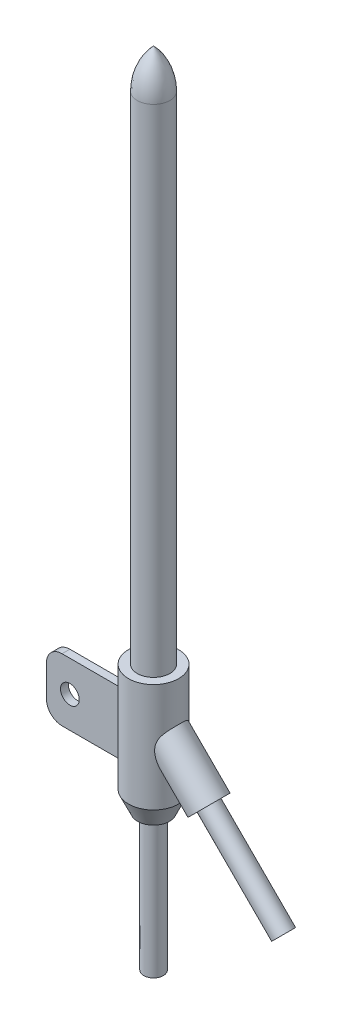
ISO-10303-21;
HEADER;
FILE_DESCRIPTION(('STEP AP214'),'2;1');
FILE_NAME('part.step','',(''),(''),'','','');
FILE_SCHEMA(('AUTOMOTIVE_DESIGN { 1 0 10303 214 1 1 1 1 }'));
ENDSEC;
DATA;
#1=APPLICATION_CONTEXT('core data for automotive mechanical design processes');
#2=APPLICATION_PROTOCOL_DEFINITION('international standard','automotive_design',2000,#1);
#3=PRODUCT_CONTEXT('',#1,'mechanical');
#4=PRODUCT('Part','Part','',(#3));
#5=PRODUCT_RELATED_PRODUCT_CATEGORY('part','',(#4));
#6=PRODUCT_DEFINITION_FORMATION('','',#4);
#7=PRODUCT_DEFINITION_CONTEXT('part definition',#1,'design');
#8=PRODUCT_DEFINITION('design','',#6,#7);
#9=PRODUCT_DEFINITION_SHAPE('','',#8);
#10=(LENGTH_UNIT() NAMED_UNIT(*) SI_UNIT(.MILLI.,.METRE.));
#11=(NAMED_UNIT(*) PLANE_ANGLE_UNIT() SI_UNIT($,.RADIAN.));
#12=(NAMED_UNIT(*) SI_UNIT($,.STERADIAN.) SOLID_ANGLE_UNIT());
#13=UNCERTAINTY_MEASURE_WITH_UNIT(LENGTH_MEASURE(1.E-05),#10,'distance_accuracy_value','');
#14=(GEOMETRIC_REPRESENTATION_CONTEXT(3) GLOBAL_UNCERTAINTY_ASSIGNED_CONTEXT((#13)) GLOBAL_UNIT_ASSIGNED_CONTEXT((#10,
#11,#12)) REPRESENTATION_CONTEXT('',''));
#15=CARTESIAN_POINT('',(0.,0.,0.));
#16=DIRECTION('',(0.,0.,1.));
#17=DIRECTION('',(1.,0.,0.));
#18=AXIS2_PLACEMENT_3D('',#15,#16,#17);
#19=CARTESIAN_POINT('',(0.,0.,0.));
#20=DIRECTION('',(0.,1.,0.));
#21=DIRECTION('',(0.,0.,1.));
#22=AXIS2_PLACEMENT_3D('',#19,#20,#21);
#23=CYLINDRICAL_SURFACE('',#22,3.21);
#24=CARTESIAN_POINT('',(0.,-4.2,0.));
#25=DIRECTION('',(0.,-1.,0.));
#26=DIRECTION('',(0.,0.,-1.));
#27=AXIS2_PLACEMENT_3D('',#24,#25,#26);
#28=CIRCLE('',#27,3.21);
#29=CARTESIAN_POINT('',(-3.17082008319614,-4.2,-0.5));
#30=VERTEX_POINT('',#29);
#31=CARTESIAN_POINT('',(-3.17082008319614,-4.2,0.5));
#32=VERTEX_POINT('',#31);
#33=EDGE_CURVE('E101',#30,#32,#28,.F.);
#34=ORIENTED_EDGE('',*,*,#33,.T.);
#35=DIRECTION('',(0.,1.,0.));
#36=VECTOR('',#35,1.);
#37=CARTESIAN_POINT('',(-3.17082008319614,0.,0.5));
#38=LINE('',#37,#36);
#39=CARTESIAN_POINT('',(-3.17082008319614,-12.2,0.5));
#40=VERTEX_POINT('',#39);
#41=EDGE_CURVE('E108',#32,#40,#38,.F.);
#42=ORIENTED_EDGE('',*,*,#41,.T.);
#43=CARTESIAN_POINT('',(0.,-12.2,0.));
#44=DIRECTION('',(0.,1.,0.));
#45=DIRECTION('',(0.,0.,1.));
#46=AXIS2_PLACEMENT_3D('',#43,#44,#45);
#47=CIRCLE('',#46,3.21);
#48=CARTESIAN_POINT('',(-3.17082008319614,-12.2,-0.500000000000001));
#49=VERTEX_POINT('',#48);
#50=EDGE_CURVE('E120',#40,#49,#47,.F.);
#51=ORIENTED_EDGE('',*,*,#50,.T.);
#52=DIRECTION('',(0.,1.,0.));
#53=VECTOR('',#52,1.);
#54=CARTESIAN_POINT('',(-3.17082008319614,0.,-0.5));
#55=LINE('',#54,#53);
#56=EDGE_CURVE('E115',#49,#30,#55,.T.);
#57=ORIENTED_EDGE('',*,*,#56,.T.);
#58=EDGE_LOOP('',(#34,#42,#51,#57));
#59=FACE_BOUND('',#58,.T.);
#60=CARTESIAN_POINT('',(0.,0.,0.));
#61=DIRECTION('',(0.,1.,0.));
#62=DIRECTION('',(0.,0.,1.));
#63=AXIS2_PLACEMENT_3D('',#60,#61,#62);
#64=CIRCLE('',#63,3.21);
#65=CARTESIAN_POINT('',(0.,0.,3.21));
#66=VERTEX_POINT('',#65);
#67=EDGE_CURVE('E150',#66,#66,#64,.T.);
#68=ORIENTED_EDGE('',*,*,#67,.F.);
#69=EDGE_LOOP('',(#68));
#70=FACE_BOUND('',#69,.T.);
#71=CARTESIAN_POINT('',(0.,-13.9,0.));
#72=DIRECTION('',(0.,1.,0.));
#73=DIRECTION('',(0.,0.,1.));
#74=AXIS2_PLACEMENT_3D('',#71,#72,#73);
#75=CIRCLE('',#74,3.21);
#76=CARTESIAN_POINT('',(0.,-13.9,3.21));
#77=VERTEX_POINT('',#76);
#78=EDGE_CURVE('E153',#77,#77,#75,.T.);
#79=ORIENTED_EDGE('',*,*,#78,.T.);
#80=EDGE_LOOP('',(#79));
#81=FACE_BOUND('',#80,.T.);
#82=CARTESIAN_POINT('',(3.21000000000001,-5.08873016277919,0.));
#83=CARTESIAN_POINT('',(3.20999311431765,-5.08873084020394,0.122870123853463));
#84=CARTESIAN_POINT('',(3.20289129528527,-5.09623393206909,0.245890223543839));
#85=CARTESIAN_POINT('',(3.1749496931834,-5.12638812685594,0.488646691791238));
#86=CARTESIAN_POINT('',(3.1540822234404,-5.14906975950939,0.608375934901423));
#87=CARTESIAN_POINT('',(3.10018620671481,-5.20991593801824,0.840943355881552));
#88=CARTESIAN_POINT('',(3.06716075189405,-5.24807654732925,0.95378327742489));
#89=CARTESIAN_POINT('',(2.99161933363153,-5.34048957741972,1.16932385838457));
#90=CARTESIAN_POINT('',(2.94910579151174,-5.39473789383986,1.27202709501542));
#91=CARTESIAN_POINT('',(2.88168894219305,-5.48802321719391,1.41517683404526));
#92=CARTESIAN_POINT('',(2.85879966806823,-5.52080547622095,1.46076414014724));
#93=CARTESIAN_POINT('',(2.81233193096208,-5.59042885279513,1.54833313252261));
#94=CARTESIAN_POINT('',(2.78875380814502,-5.62726799107416,1.59031655941932));
#95=CARTESIAN_POINT('',(2.74159261399743,-5.7049612576937,1.67030737586882));
#96=CARTESIAN_POINT('',(2.71800956596613,-5.74581176452394,1.70831828899278));
#97=CARTESIAN_POINT('',(2.67154272996064,-5.83141302767368,1.78010915761564));
#98=CARTESIAN_POINT('',(2.64865884818386,-5.87616325766164,1.81388968257954));
#99=CARTESIAN_POINT('',(2.5859897521827,-6.00790577253146,1.90308038422832));
#100=CARTESIAN_POINT('',(2.54784317116086,-6.09927918817493,1.95333188603162));
#101=CARTESIAN_POINT('',(2.48015282434276,-6.29171710083478,2.03861704467622));
#102=CARTESIAN_POINT('',(2.45060875235446,-6.39278125275521,2.07365124317404));
#103=CARTESIAN_POINT('',(2.41188619013263,-6.55831911203861,2.11834108221631));
#104=CARTESIAN_POINT('',(2.39931935250274,-6.62086417256317,2.13251684746763));
#105=CARTESIAN_POINT('',(2.37779787659621,-6.74740531966717,2.15648664757411));
#106=CARTESIAN_POINT('',(2.36884401385606,-6.81140171466969,2.16627974172424));
#107=CARTESIAN_POINT('',(2.34718118573283,-7.00485050935955,2.18982722576474));
#108=CARTESIAN_POINT('',(2.33970198983663,-7.13562537927791,2.19771558245089));
#109=CARTESIAN_POINT('',(2.33647680485254,-7.37588901625346,2.20112167481393));
#110=CARTESIAN_POINT('',(2.33901748881019,-7.48537394185722,2.1984457394267));
#111=CARTESIAN_POINT('',(2.35047846360956,-7.70368389541433,2.18618967509848));
#112=CARTESIAN_POINT('',(2.35940374081411,-7.81250834049707,2.17660414972759));
#113=CARTESIAN_POINT('',(2.38229977552922,-8.02933119125767,2.15151873825194));
#114=CARTESIAN_POINT('',(2.39628998247185,-8.13732475115393,2.13599604012583));
#115=CARTESIAN_POINT('',(2.42818005197748,-8.35184768587803,2.09967260901935));
#116=CARTESIAN_POINT('',(2.44608109861089,-8.45837660685709,2.07887027723475));
#117=CARTESIAN_POINT('',(2.49588695963398,-8.72975321370137,2.01913544419775));
#118=CARTESIAN_POINT('',(2.52997687148933,-8.8934192739933,1.9766109004265));
#119=CARTESIAN_POINT('',(2.60292102982417,-9.21622380215978,1.87952176844961));
#120=CARTESIAN_POINT('',(2.64178067731668,-9.37535688126347,1.82494347424527));
#121=CARTESIAN_POINT('',(2.72219933911561,-9.68773099630865,1.70267871639446));
#122=CARTESIAN_POINT('',(2.76375570100529,-9.84097759270842,1.63500500696643));
#123=CARTESIAN_POINT('',(2.82662963229799,-10.064617158084,1.52187557922512));
#124=CARTESIAN_POINT('',(2.84765994013671,-10.1380672715441,1.48226673758558));
#125=CARTESIAN_POINT('',(2.88964641162839,-10.2824899077414,1.39865600176153));
#126=CARTESIAN_POINT('',(2.91060256178837,-10.3534619985312,1.35465334679441));
#127=CARTESIAN_POINT('',(2.95029996725553,-10.4861972191377,1.2656979997688));
#128=CARTESIAN_POINT('',(2.96907574714885,-10.5482253163696,1.2211583285026));
#129=CARTESIAN_POINT('',(3.00593797372499,-10.6688011303841,1.12737547771214));
#130=CARTESIAN_POINT('',(3.0240248924609,-10.727351246488,1.07813560326823));
#131=CARTESIAN_POINT('',(3.05894602443517,-10.8394610931837,0.974634465621498));
#132=CARTESIAN_POINT('',(3.0757884171283,-10.893054127416,0.920412474168766));
#133=CARTESIAN_POINT('',(3.10772138705329,-10.9939849200873,0.806030842583719));
#134=CARTESIAN_POINT('',(3.12281513079639,-11.041334007479,0.745882311997692));
#135=CARTESIAN_POINT('',(3.14799823123335,-11.1199289530871,0.630137123920566));
#136=CARTESIAN_POINT('',(3.15850133325356,-11.1525431715321,0.575572102270518));
#137=CARTESIAN_POINT('',(3.17709036300056,-11.2100845163059,0.462058785561174));
#138=CARTESIAN_POINT('',(3.18517644566854,-11.2350121353814,0.403110771772888));
#139=CARTESIAN_POINT('',(3.19827794054241,-11.2753260019749,0.28092889738826));
#140=CARTESIAN_POINT('',(3.20326043130665,-11.2906099755652,0.217656734191248));
#141=CARTESIAN_POINT('',(3.20940093848116,-11.3094382581878,0.0892214229249783));
#142=CARTESIAN_POINT('',(3.21056365391797,-11.312996991439,0.024060697812859));
#143=CARTESIAN_POINT('',(3.20899895294742,-11.3082027390738,-0.0992603307918366));
#144=CARTESIAN_POINT('',(3.20664575947551,-11.3009956522405,-0.15747423531002));
#145=CARTESIAN_POINT('',(3.19898450701758,-11.2774851873005,-0.271828574719362));
#146=CARTESIAN_POINT('',(3.1936740606494,-11.2611744598255,-0.32796729522243));
#147=CARTESIAN_POINT('',(3.17841770456261,-11.2141776481016,-0.455089106135116));
#148=CARTESIAN_POINT('',(3.16751990482844,-11.1805223544136,-0.524847583579714));
#149=CARTESIAN_POINT('',(3.14259261526189,-11.1031066647564,-0.657895041444185));
#150=CARTESIAN_POINT('',(3.12855579037012,-11.0593225921534,-0.721168354360491));
#151=CARTESIAN_POINT('',(3.10091062527564,-10.9724904045089,-0.831331932707917));
#152=CARTESIAN_POINT('',(3.08762344283904,-10.9305445265991,-0.879192148952453));
#153=CARTESIAN_POINT('',(3.06001119983444,-10.8427985215549,-0.970939818749609));
#154=CARTESIAN_POINT('',(3.04568540466112,-10.7969956626262,-1.01482441002563));
#155=CARTESIAN_POINT('',(3.00162008533716,-10.6550344339842,-1.14122120891331));
#156=CARTESIAN_POINT('',(2.97082422773048,-10.5544218881508,-1.21835918752489));
#157=CARTESIAN_POINT('',(2.9082992817983,-10.3460691374395,-1.36084745971319));
#158=CARTESIAN_POINT('',(2.87657260524961,-10.2383465807271,-1.42622554278903));
#159=CARTESIAN_POINT('',(2.81316082750106,-10.0175980420999,-1.54754873430624));
#160=CARTESIAN_POINT('',(2.7814758003391,-9.90456682891464,-1.60348427752569));
#161=CARTESIAN_POINT('',(2.71892100304671,-9.67411377905549,-1.70741212916448));
#162=CARTESIAN_POINT('',(2.68805529115286,-9.55667525726479,-1.75536950491916));
#163=CARTESIAN_POINT('',(2.62811552640189,-9.31867763426748,-1.84389817684783));
#164=CARTESIAN_POINT('',(2.59904069475169,-9.19811992234577,-1.88447269879046));
#165=CARTESIAN_POINT('',(2.54002797297156,-8.93879178129103,-1.96343678483336));
#166=CARTESIAN_POINT('',(2.51045010087669,-8.79965410406099,-2.00089313351377));
#167=CARTESIAN_POINT('',(2.45621527859292,-8.51824091585318,-2.06710821909327));
#168=CARTESIAN_POINT('',(2.43156217700148,-8.37596304655453,-2.09586016267011));
#169=CARTESIAN_POINT('',(2.38941437202781,-8.08959455978903,-2.14378429774904));
#170=CARTESIAN_POINT('',(2.37187791626659,-7.94551978186435,-2.16301251487465));
#171=CARTESIAN_POINT('',(2.3465737847621,-7.65557968977595,-2.19044742792173));
#172=CARTESIAN_POINT('',(2.33878916748208,-7.50971792662671,-2.1986732396363));
#173=CARTESIAN_POINT('',(2.33675611224054,-7.24202573111427,-2.20083527026306));
#174=CARTESIAN_POINT('',(2.34046394565105,-7.12025066419454,-2.19692874955839));
#175=CARTESIAN_POINT('',(2.35934940449924,-6.8786139663304,-2.17664580893349));
#176=CARTESIAN_POINT('',(2.37451424621004,-6.75875035468643,-2.16028328726104));
#177=CARTESIAN_POINT('',(2.41794978078693,-6.52286785997722,-2.11156513742234));
#178=CARTESIAN_POINT('',(2.44638062005174,-6.4069150633484,-2.07901375277063));
#179=CARTESIAN_POINT('',(2.49777822107881,-6.24104465354132,-2.016408398628));
#180=CARTESIAN_POINT('',(2.51637497418198,-6.18708534400865,-1.99323615769491));
#181=CARTESIAN_POINT('',(2.55596807735027,-6.08235848946096,-1.94220993792781));
#182=CARTESIAN_POINT('',(2.57696420784941,-6.03159065305365,-1.91435638736873));
#183=CARTESIAN_POINT('',(2.63736049017951,-5.89656420783095,-1.83104057515026));
#184=CARTESIAN_POINT('',(2.6786417983489,-5.8161066770793,-1.77066051522982));
#185=CARTESIAN_POINT('',(2.7625584627489,-5.6680235251077,-1.63664629711214));
#186=CARTESIAN_POINT('',(2.80519455990868,-5.60040507159894,-1.56300477983426));
#187=CARTESIAN_POINT('',(2.88769278735599,-5.47844997888725,-1.40472731952727));
#188=CARTESIAN_POINT('',(2.92756600600785,-5.42405774899574,-1.32013976624783));
#189=CARTESIAN_POINT('',(3.00162051009025,-5.32783243251658,-1.14179997129103));
#190=CARTESIAN_POINT('',(3.03579879376697,-5.28600595996926,-1.04804293751142));
#191=CARTESIAN_POINT('',(3.09906978280692,-5.21099371676397,-0.844015940664478));
#192=CARTESIAN_POINT('',(3.12733396503225,-5.17905913420678,-0.733028453924925));
#193=CARTESIAN_POINT('',(3.17201629569762,-5.12945974307399,-0.505755778399475));
#194=CARTESIAN_POINT('',(3.18845341971215,-5.11177207099209,-0.389479395407311));
#195=CARTESIAN_POINT('',(3.20228558684713,-5.09695262783307,-0.227009877899133));
#196=CARTESIAN_POINT('',(3.20517422343544,-5.09386925990056,-0.181716127292507));
#197=CARTESIAN_POINT('',(3.2090326956506,-5.08975791155265,-0.0909551017359539));
#198=CARTESIAN_POINT('',(3.21000254915295,-5.08872991198933,-0.0454878284065279));
#199=CARTESIAN_POINT('',(3.21000000000001,-5.08873016277919,0.));
#200=B_SPLINE_CURVE_WITH_KNOTS('',3,(#82,#83,#84,#85,#86,#87,#88,#89,#90,#91,#92,#93,#94,#95,
#96,#97,#98,#99,#100,#101,#102,#103,#104,#105,#106,#107,#108,#109,#110,#111,#112,#113,#114,#115,
#116,#117,#118,#119,#120,#121,#122,#123,#124,#125,#126,#127,#128,#129,#130,#131,#132,#133,#134,
#135,#136,#137,#138,#139,#140,#141,#142,#143,#144,#145,#146,#147,#148,#149,#150,#151,#152,#153,
#154,#155,#156,#157,#158,#159,#160,#161,#162,#163,#164,#165,#166,#167,#168,#169,#170,#171,#172,
#173,#174,#175,#176,#177,#178,#179,#180,#181,#182,#183,#184,#185,#186,#187,#188,#189,#190,#191,
#192,#193,#194,#195,#196,#197,#198,#199),.UNSPECIFIED.,.T.,.F.,(4,2,2,2,2,2,2,2,2,2,2,2,2,2,2,2,
2,2,2,2,2,2,2,2,2,2,2,2,2,2,2,2,2,2,2,2,2,2,2,2,2,2,2,2,2,2,2,2,2,2,2,2,2,2,2,2,2,2,4),(0.,
0.368441654801494,0.737626620153166,1.10671775483575,1.4757148064212,1.6574227582893,
1.83904244807273,2.02049965120281,2.20193240152807,2.53310708811124,2.86426998563921,
3.06007335869533,3.25591873923441,3.64803801808704,3.97626172330713,4.30474205127501,
4.63449736697885,4.96435266017919,5.4812384859276,5.99871510282935,6.51569023964355,
6.77375246253244,7.03185944627085,7.26759188002828,7.50315975614085,7.737008330689,
7.97042659723548,8.16319298703953,8.35594701704989,8.55071234659274,8.74523798904392,
8.9204792474333,9.09586218313173,9.32919839086895,9.5630856483315,9.75784562301094,
9.95274472017444,10.3430069660992,10.7323345182625,11.1220541200095,11.5134376016127,
11.9046496643855,12.3455863395015,12.7868662601806,13.2255184639314,13.6634075505331,
14.0281574726656,14.3925010069104,14.7613614161338,14.945882590261,15.1303868924384,
15.4548205928527,15.7794348867314,16.1026602611161,16.4260554696852,16.7811952020531,
17.1357638626661,17.2721661578819,17.4085671823605),.UNSPECIFIED.);
#201=CARTESIAN_POINT('',(3.21000000000001,-5.08873016277919,0.));
#202=VERTEX_POINT('',#201);
#203=EDGE_CURVE('E147',#202,#202,#200,.T.);
#204=ORIENTED_EDGE('',*,*,#203,.F.);
#205=EDGE_LOOP('',(#204));
#206=FACE_BOUND('',#205,.T.);
#207=ADVANCED_FACE('F38',(#59,#70,#81,#206),#23,.T.);
#208=CARTESIAN_POINT('',(0.,63.5,0.));
#209=DIRECTION('',(0.,-1.,0.));
#210=DIRECTION('',(0.,0.,-1.));
#211=AXIS2_PLACEMENT_3D('',#208,#209,#210);
#212=CYLINDRICAL_SURFACE('',#211,2.085);
#213=CARTESIAN_POINT('',(0.,63.5,0.));
#214=DIRECTION('',(0.,1.,0.));
#215=DIRECTION('',(0.,0.,1.));
#216=AXIS2_PLACEMENT_3D('',#213,#214,#215);
#217=CIRCLE('',#216,2.085);
#218=CARTESIAN_POINT('',(0.,63.5,2.085));
#219=VERTEX_POINT('',#218);
#220=EDGE_CURVE('E160',#219,#219,#217,.T.);
#221=ORIENTED_EDGE('',*,*,#220,.F.);
#222=EDGE_LOOP('',(#221));
#223=FACE_BOUND('',#222,.T.);
#224=CARTESIAN_POINT('',(0.,0.,0.));
#225=DIRECTION('',(0.,1.,0.));
#226=DIRECTION('',(0.,0.,1.));
#227=AXIS2_PLACEMENT_3D('',#224,#225,#226);
#228=CIRCLE('',#227,2.085);
#229=CARTESIAN_POINT('',(0.,0.,2.085));
#230=VERTEX_POINT('',#229);
#231=EDGE_CURVE('E159',#230,#230,#228,.T.);
#232=ORIENTED_EDGE('',*,*,#231,.T.);
#233=EDGE_LOOP('',(#232));
#234=FACE_BOUND('',#233,.T.);
#235=ADVANCED_FACE('F228',(#223,#234),#212,.T.);
#236=CARTESIAN_POINT('',(0.,63.5,4.95270383693047));
#237=DIRECTION('',(-1.,0.,0.));
#238=DIRECTION('',(0.,0.,-1.));
#239=AXIS2_PLACEMENT_3D('',#236,#237,#238);
#240=CIRCLE('',#239,7.03770383693047);
#241=TRIMMED_CURVE('',#240,(PARAMETER_VALUE(-0.790150219504949)),
(PARAMETER_VALUE(0.790150219504949)),.T.,.PARAMETER.);
#242=CARTESIAN_POINT('',(0.,63.5,0.));
#243=DIRECTION('',(0.,-1.,0.));
#244=AXIS1_PLACEMENT('',#242,#243);
#245=SURFACE_OF_REVOLUTION('',#241,#244);
#246=CARTESIAN_POINT('',(0.,68.5,0.));
#247=VERTEX_POINT('',#246);
#248=VERTEX_LOOP('',#247);
#249=FACE_BOUND('',#248,.T.);
#250=ORIENTED_EDGE('',*,*,#220,.T.);
#251=EDGE_LOOP('',(#250));
#252=FACE_BOUND('',#251,.T.);
#253=ADVANCED_FACE('F232',(#249,#252),#245,.T.);
#254=CARTESIAN_POINT('',(3.21,0.,0.));
#255=DIRECTION('',(0.,-1.,0.));
#256=DIRECTION('',(0.,0.,-1.));
#257=AXIS2_PLACEMENT_3D('',#254,#255,#256);
#258=PLANE('',#257);
#259=ORIENTED_EDGE('',*,*,#231,.F.);
#260=EDGE_LOOP('',(#259));
#261=FACE_BOUND('',#260,.T.);
#262=ORIENTED_EDGE('',*,*,#67,.T.);
#263=EDGE_LOOP('',(#262));
#264=FACE_BOUND('',#263,.T.);
#265=ADVANCED_FACE('F238',(#261,#264),#258,.F.);
#266=CARTESIAN_POINT('',(0.,-16.4,0.));
#267=DIRECTION('',(0.,1.,0.));
#268=DIRECTION('',(0.,0.,1.));
#269=AXIS2_PLACEMENT_3D('',#266,#267,#268);
#270=PLANE('',#269);
#271=CARTESIAN_POINT('',(0.,-16.4,0.));
#272=DIRECTION('',(0.,-1.,0.));
#273=DIRECTION('',(0.,0.,-1.));
#274=AXIS2_PLACEMENT_3D('',#271,#272,#273);
#275=CIRCLE('',#274,1.25);
#276=CARTESIAN_POINT('',(0.,-16.4,-1.25));
#277=VERTEX_POINT('',#276);
#278=EDGE_CURVE('E137',#277,#277,#275,.T.);
#279=ORIENTED_EDGE('',*,*,#278,.F.);
#280=EDGE_LOOP('',(#279));
#281=FACE_BOUND('',#280,.T.);
#282=CARTESIAN_POINT('',(0.,-16.4,0.));
#283=DIRECTION('',(0.,1.,0.));
#284=DIRECTION('',(0.,0.,1.));
#285=AXIS2_PLACEMENT_3D('',#282,#283,#284);
#286=CIRCLE('',#285,2.05);
#287=CARTESIAN_POINT('',(0.,-16.4,2.05));
#288=VERTEX_POINT('',#287);
#289=EDGE_CURVE('E156',#288,#288,#286,.T.);
#290=ORIENTED_EDGE('',*,*,#289,.F.);
#291=EDGE_LOOP('',(#290));
#292=FACE_BOUND('',#291,.T.);
#293=ADVANCED_FACE('F246',(#281,#292),#270,.F.);
#294=CARTESIAN_POINT('',(0.,-16.4,0.));
#295=DIRECTION('',(0.,1.,0.));
#296=DIRECTION('',(0.,0.,1.));
#297=AXIS2_PLACEMENT_3D('',#294,#295,#296);
#298=CONICAL_SURFACE('',#297,2.05,0.434435142280984);
#299=ORIENTED_EDGE('',*,*,#78,.F.);
#300=EDGE_LOOP('',(#299));
#301=FACE_BOUND('',#300,.T.);
#302=ORIENTED_EDGE('',*,*,#289,.T.);
#303=EDGE_LOOP('',(#302));
#304=FACE_BOUND('',#303,.T.);
#305=ADVANCED_FACE('F180',(#301,#304),#298,.T.);
#306=CARTESIAN_POINT('',(-36.7464704021733,31.7564704021731,0.));
#307=DIRECTION('',(0.707106781186549,-0.707106781186546,0.));
#308=DIRECTION('',(0.707106781186546,0.707106781186549,0.));
#309=AXIS2_PLACEMENT_3D('',#306,#307,#308);
#310=CYLINDRICAL_SURFACE('',#309,2.2);
#311=CARTESIAN_POINT('',(7.09908729652602,-12.089087296526,0.));
#312=DIRECTION('',(-0.707106781186549,0.707106781186546,0.));
#313=DIRECTION('',(-0.707106781186546,-0.707106781186549,0.));
#314=AXIS2_PLACEMENT_3D('',#311,#312,#313);
#315=CIRCLE('',#314,2.2);
#316=CARTESIAN_POINT('',(5.54345237791562,-13.6447222151364,0.));
#317=VERTEX_POINT('',#316);
#318=EDGE_CURVE('E144',#317,#317,#315,.T.);
#319=ORIENTED_EDGE('',*,*,#318,.T.);
#320=EDGE_LOOP('',(#319));
#321=FACE_BOUND('',#320,.T.);
#322=ORIENTED_EDGE('',*,*,#203,.T.);
#323=EDGE_LOOP('',(#322));
#324=FACE_BOUND('',#323,.T.);
#325=ADVANCED_FACE('F175',(#321,#324),#310,.T.);
#326=CARTESIAN_POINT('',(7.09908729652602,-12.089087296526,0.));
#327=DIRECTION('',(-0.707106781186549,0.707106781186546,0.));
#328=DIRECTION('',(-0.707106781186546,-0.707106781186549,0.));
#329=AXIS2_PLACEMENT_3D('',#326,#327,#328);
#330=PLANE('',#329);
#331=CARTESIAN_POINT('',(7.09908729652602,-12.089087296526,0.));
#332=DIRECTION('',(0.707106781186549,-0.707106781186546,0.));
#333=DIRECTION('',(0.707106781186546,0.707106781186549,0.));
#334=AXIS2_PLACEMENT_3D('',#331,#332,#333);
#335=CIRCLE('',#334,1.25);
#336=CARTESIAN_POINT('',(7.98297077300921,-11.2052038200428,0.));
#337=VERTEX_POINT('',#336);
#338=EDGE_CURVE('E141',#337,#337,#335,.T.);
#339=ORIENTED_EDGE('',*,*,#338,.F.);
#340=EDGE_LOOP('',(#339));
#341=FACE_BOUND('',#340,.T.);
#342=ORIENTED_EDGE('',*,*,#318,.F.);
#343=EDGE_LOOP('',(#342));
#344=FACE_BOUND('',#343,.T.);
#345=ADVANCED_FACE('F179',(#341,#344),#330,.F.);
#346=CARTESIAN_POINT('',(16.6450288425444,-21.6350288425444,0.));
#347=DIRECTION('',(-0.707106781186549,0.707106781186546,0.));
#348=DIRECTION('',(-0.707106781186546,-0.707106781186549,0.));
#349=AXIS2_PLACEMENT_3D('',#346,#347,#348);
#350=CYLINDRICAL_SURFACE('',#349,1.25);
#351=CARTESIAN_POINT('',(16.6450288425444,-21.6350288425444,0.));
#352=DIRECTION('',(0.707106781186549,-0.707106781186546,0.));
#353=DIRECTION('',(0.707106781186546,0.707106781186549,0.));
#354=AXIS2_PLACEMENT_3D('',#351,#352,#353);
#355=CIRCLE('',#354,1.25);
#356=CARTESIAN_POINT('',(17.5289123190276,-20.7511453660612,0.));
#357=VERTEX_POINT('',#356);
#358=EDGE_CURVE('E136',#357,#357,#355,.T.);
#359=ORIENTED_EDGE('',*,*,#358,.F.);
#360=EDGE_LOOP('',(#359));
#361=FACE_BOUND('',#360,.T.);
#362=ORIENTED_EDGE('',*,*,#338,.T.);
#363=EDGE_LOOP('',(#362));
#364=FACE_BOUND('',#363,.T.);
#365=ADVANCED_FACE('F184',(#361,#364),#350,.T.);
#366=CARTESIAN_POINT('',(16.6450288425444,-21.6350288425444,0.));
#367=DIRECTION('',(0.707106781186549,-0.707106781186546,0.));
#368=DIRECTION('',(0.707106781186546,0.707106781186549,0.));
#369=AXIS2_PLACEMENT_3D('',#366,#367,#368);
#370=PLANE('',#369);
#371=ORIENTED_EDGE('',*,*,#358,.T.);
#372=EDGE_LOOP('',(#371));
#373=FACE_BOUND('',#372,.T.);
#374=ADVANCED_FACE('F188',(#373),#370,.T.);
#375=CARTESIAN_POINT('',(0.,-33.9,0.));
#376=DIRECTION('',(0.,1.,0.));
#377=DIRECTION('',(0.,0.,1.));
#378=AXIS2_PLACEMENT_3D('',#375,#376,#377);
#379=CYLINDRICAL_SURFACE('',#378,1.25);
#380=CARTESIAN_POINT('',(0.,-33.9,0.));
#381=DIRECTION('',(0.,-1.,0.));
#382=DIRECTION('',(0.,0.,-1.));
#383=AXIS2_PLACEMENT_3D('',#380,#381,#382);
#384=CIRCLE('',#383,1.25);
#385=CARTESIAN_POINT('',(0.,-33.9,-1.25));
#386=VERTEX_POINT('',#385);
#387=EDGE_CURVE('E104',#386,#386,#384,.T.);
#388=ORIENTED_EDGE('',*,*,#387,.F.);
#389=EDGE_LOOP('',(#388));
#390=FACE_BOUND('',#389,.T.);
#391=ORIENTED_EDGE('',*,*,#278,.T.);
#392=EDGE_LOOP('',(#391));
#393=FACE_BOUND('',#392,.T.);
#394=ADVANCED_FACE('F192',(#390,#393),#379,.T.);
#395=CARTESIAN_POINT('',(0.,-33.9,0.));
#396=DIRECTION('',(0.,-1.,0.));
#397=DIRECTION('',(0.,0.,-1.));
#398=AXIS2_PLACEMENT_3D('',#395,#396,#397);
#399=PLANE('',#398);
#400=ORIENTED_EDGE('',*,*,#387,.T.);
#401=EDGE_LOOP('',(#400));
#402=FACE_BOUND('',#401,.T.);
#403=ADVANCED_FACE('F196',(#402),#399,.T.);
#404=CARTESIAN_POINT('',(-13.21,-12.2,0.5));
#405=DIRECTION('',(0.,0.,1.));
#406=DIRECTION('',(1.,0.,0.));
#407=AXIS2_PLACEMENT_3D('',#404,#405,#406);
#408=PLANE('',#407);
#409=CARTESIAN_POINT('',(-10.21,-8.2,0.5));
#410=DIRECTION('',(0.,0.,1.));
#411=DIRECTION('',(1.,0.,0.));
#412=AXIS2_PLACEMENT_3D('',#409,#410,#411);
#413=CIRCLE('',#412,1.2);
#414=CARTESIAN_POINT('',(-9.01,-8.2,0.5));
#415=VERTEX_POINT('',#414);
#416=EDGE_CURVE('E437',#415,#415,#413,.T.);
#417=ORIENTED_EDGE('',*,*,#416,.F.);
#418=EDGE_LOOP('',(#417));
#419=FACE_BOUND('',#418,.T.);
#420=DIRECTION('',(0.,-1.,0.));
#421=VECTOR('',#420,1.);
#422=CARTESIAN_POINT('',(-13.21,-12.2,0.5));
#423=LINE('',#422,#421);
#424=CARTESIAN_POINT('',(-13.21,-6.2,0.5));
#425=VERTEX_POINT('',#424);
#426=CARTESIAN_POINT('',(-13.21,-10.2,0.5));
#427=VERTEX_POINT('',#426);
#428=EDGE_CURVE('E122',#425,#427,#423,.T.);
#429=ORIENTED_EDGE('',*,*,#428,.T.);
#430=CARTESIAN_POINT('',(-11.21,-10.2,0.5));
#431=DIRECTION('',(0.,0.,1.));
#432=DIRECTION('',(1.,0.,0.));
#433=AXIS2_PLACEMENT_3D('',#430,#431,#432);
#434=CIRCLE('',#433,2.);
#435=CARTESIAN_POINT('',(-11.21,-12.2,0.5));
#436=VERTEX_POINT('',#435);
#437=EDGE_CURVE('E46',#427,#436,#434,.T.);
#438=ORIENTED_EDGE('',*,*,#437,.T.);
#439=DIRECTION('',(1.,0.,0.));
#440=VECTOR('',#439,1.);
#441=CARTESIAN_POINT('',(-13.21,-12.2,0.5));
#442=LINE('',#441,#440);
#443=EDGE_CURVE('E111',#436,#40,#442,.T.);
#444=ORIENTED_EDGE('',*,*,#443,.T.);
#445=ORIENTED_EDGE('',*,*,#41,.F.);
#446=DIRECTION('',(1.,0.,0.));
#447=VECTOR('',#446,1.);
#448=CARTESIAN_POINT('',(-13.21,-4.2,0.5));
#449=LINE('',#448,#447);
#450=CARTESIAN_POINT('',(-11.21,-4.2,0.5));
#451=VERTEX_POINT('',#450);
#452=EDGE_CURVE('E96',#451,#32,#449,.T.);
#453=ORIENTED_EDGE('',*,*,#452,.F.);
#454=CARTESIAN_POINT('',(-11.21,-6.2,0.5));
#455=DIRECTION('',(0.,0.,1.));
#456=DIRECTION('',(1.,0.,0.));
#457=AXIS2_PLACEMENT_3D('',#454,#455,#456);
#458=CIRCLE('',#457,2.);
#459=EDGE_CURVE('E53',#451,#425,#458,.T.);
#460=ORIENTED_EDGE('',*,*,#459,.T.);
#461=EDGE_LOOP('',(#429,#438,#444,#445,#453,#460));
#462=FACE_BOUND('',#461,.T.);
#463=ADVANCED_FACE('F109',(#419,#462),#408,.T.);
#464=CARTESIAN_POINT('',(-13.21,-4.2,-0.5));
#465=DIRECTION('',(0.,1.,0.));
#466=DIRECTION('',(0.,0.,1.));
#467=AXIS2_PLACEMENT_3D('',#464,#465,#466);
#468=PLANE('',#467);
#469=DIRECTION('',(1.,0.,0.));
#470=VECTOR('',#469,1.);
#471=CARTESIAN_POINT('',(-13.21,-4.2,-0.5));
#472=LINE('',#471,#470);
#473=CARTESIAN_POINT('',(-11.21,-4.2,-0.5));
#474=VERTEX_POINT('',#473);
#475=EDGE_CURVE('E105',#474,#30,#472,.T.);
#476=ORIENTED_EDGE('',*,*,#475,.F.);
#477=DIRECTION('',(0.,0.,1.));
#478=VECTOR('',#477,1.);
#479=CARTESIAN_POINT('',(-11.21,-4.2,0.5));
#480=LINE('',#479,#478);
#481=EDGE_CURVE('E11',#474,#451,#480,.T.);
#482=ORIENTED_EDGE('',*,*,#481,.T.);
#483=ORIENTED_EDGE('',*,*,#452,.T.);
#484=ORIENTED_EDGE('',*,*,#33,.F.);
#485=EDGE_LOOP('',(#476,#482,#483,#484));
#486=FACE_BOUND('',#485,.T.);
#487=ADVANCED_FACE('F99',(#486),#468,.T.);
#488=CARTESIAN_POINT('',(-13.21,-12.2,-0.5));
#489=DIRECTION('',(0.,0.,-1.));
#490=DIRECTION('',(-1.,0.,0.));
#491=AXIS2_PLACEMENT_3D('',#488,#489,#490);
#492=PLANE('',#491);
#493=CARTESIAN_POINT('',(-10.21,-8.2,-0.5));
#494=DIRECTION('',(0.,0.,-1.));
#495=DIRECTION('',(-1.,0.,0.));
#496=AXIS2_PLACEMENT_3D('',#493,#494,#495);
#497=CIRCLE('',#496,1.2);
#498=CARTESIAN_POINT('',(-11.41,-8.2,-0.5));
#499=VERTEX_POINT('',#498);
#500=EDGE_CURVE('E116',#499,#499,#497,.T.);
#501=ORIENTED_EDGE('',*,*,#500,.F.);
#502=EDGE_LOOP('',(#501));
#503=FACE_BOUND('',#502,.T.);
#504=DIRECTION('',(1.,0.,0.));
#505=VECTOR('',#504,1.);
#506=CARTESIAN_POINT('',(-13.21,-12.2,-0.5));
#507=LINE('',#506,#505);
#508=CARTESIAN_POINT('',(-11.21,-12.2,-0.5));
#509=VERTEX_POINT('',#508);
#510=EDGE_CURVE('E131',#509,#49,#507,.T.);
#511=ORIENTED_EDGE('',*,*,#510,.F.);
#512=CARTESIAN_POINT('',(-11.21,-10.2,-0.5));
#513=DIRECTION('',(0.,0.,-1.));
#514=DIRECTION('',(-1.,0.,0.));
#515=AXIS2_PLACEMENT_3D('',#512,#513,#514);
#516=CIRCLE('',#515,2.);
#517=CARTESIAN_POINT('',(-13.21,-10.2,-0.5));
#518=VERTEX_POINT('',#517);
#519=EDGE_CURVE('E419',#509,#518,#516,.T.);
#520=ORIENTED_EDGE('',*,*,#519,.T.);
#521=DIRECTION('',(0.,1.,0.));
#522=VECTOR('',#521,1.);
#523=CARTESIAN_POINT('',(-13.21,-12.2,-0.5));
#524=LINE('',#523,#522);
#525=CARTESIAN_POINT('',(-13.21,-6.2,-0.5));
#526=VERTEX_POINT('',#525);
#527=EDGE_CURVE('E127',#518,#526,#524,.T.);
#528=ORIENTED_EDGE('',*,*,#527,.T.);
#529=CARTESIAN_POINT('',(-11.21,-6.2,-0.5));
#530=DIRECTION('',(0.,0.,-1.));
#531=DIRECTION('',(-1.,0.,0.));
#532=AXIS2_PLACEMENT_3D('',#529,#530,#531);
#533=CIRCLE('',#532,2.);
#534=EDGE_CURVE('E416',#526,#474,#533,.T.);
#535=ORIENTED_EDGE('',*,*,#534,.T.);
#536=ORIENTED_EDGE('',*,*,#475,.T.);
#537=ORIENTED_EDGE('',*,*,#56,.F.);
#538=EDGE_LOOP('',(#511,#520,#528,#535,#536,#537));
#539=FACE_BOUND('',#538,.T.);
#540=ADVANCED_FACE('F208',(#503,#539),#492,.T.);
#541=CARTESIAN_POINT('',(-13.21,-12.2,-0.5));
#542=DIRECTION('',(0.,-1.,0.));
#543=DIRECTION('',(0.,0.,-1.));
#544=AXIS2_PLACEMENT_3D('',#541,#542,#543);
#545=PLANE('',#544);
#546=ORIENTED_EDGE('',*,*,#443,.F.);
#547=DIRECTION('',(0.,0.,-1.));
#548=VECTOR('',#547,1.);
#549=CARTESIAN_POINT('',(-11.21,-12.2,-0.5));
#550=LINE('',#549,#548);
#551=EDGE_CURVE('E140',#436,#509,#550,.T.);
#552=ORIENTED_EDGE('',*,*,#551,.T.);
#553=ORIENTED_EDGE('',*,*,#510,.T.);
#554=ORIENTED_EDGE('',*,*,#50,.F.);
#555=EDGE_LOOP('',(#546,#552,#553,#554));
#556=FACE_BOUND('',#555,.T.);
#557=ADVANCED_FACE('F204',(#556),#545,.T.);
#558=CARTESIAN_POINT('',(-13.21,0.,0.));
#559=DIRECTION('',(1.,0.,0.));
#560=DIRECTION('',(0.,0.,-1.));
#561=AXIS2_PLACEMENT_3D('',#558,#559,#560);
#562=PLANE('',#561);
#563=ORIENTED_EDGE('',*,*,#527,.F.);
#564=DIRECTION('',(0.,0.,-1.));
#565=VECTOR('',#564,1.);
#566=CARTESIAN_POINT('',(-13.21,-10.2,0.5));
#567=LINE('',#566,#565);
#568=EDGE_CURVE('E60',#518,#427,#567,.F.);
#569=ORIENTED_EDGE('',*,*,#568,.T.);
#570=ORIENTED_EDGE('',*,*,#428,.F.);
#571=DIRECTION('',(0.,0.,1.));
#572=VECTOR('',#571,1.);
#573=CARTESIAN_POINT('',(-13.21,-6.2,-0.5));
#574=LINE('',#573,#572);
#575=EDGE_CURVE('E417',#425,#526,#574,.F.);
#576=ORIENTED_EDGE('',*,*,#575,.T.);
#577=EDGE_LOOP('',(#563,#569,#570,#576));
#578=FACE_BOUND('',#577,.T.);
#579=ADVANCED_FACE('F207',(#578),#562,.F.);
#580=CARTESIAN_POINT('',(-10.21,-8.2,0.5));
#581=DIRECTION('',(0.,0.,1.));
#582=DIRECTION('',(1.,0.,0.));
#583=AXIS2_PLACEMENT_3D('',#580,#581,#582);
#584=CYLINDRICAL_SURFACE('',#583,1.2);
#585=ORIENTED_EDGE('',*,*,#500,.T.);
#586=EDGE_LOOP('',(#585));
#587=FACE_BOUND('',#586,.T.);
#588=ORIENTED_EDGE('',*,*,#416,.T.);
#589=EDGE_LOOP('',(#588));
#590=FACE_BOUND('',#589,.T.);
#591=ADVANCED_FACE('F217',(#587,#590),#584,.F.);
#592=CARTESIAN_POINT('',(-11.21,-10.2,-0.5));
#593=DIRECTION('',(0.,0.,1.));
#594=DIRECTION('',(1.,0.,0.));
#595=AXIS2_PLACEMENT_3D('',#592,#593,#594);
#596=CYLINDRICAL_SURFACE('',#595,2.);
#597=ORIENTED_EDGE('',*,*,#437,.F.);
#598=ORIENTED_EDGE('',*,*,#568,.F.);
#599=ORIENTED_EDGE('',*,*,#519,.F.);
#600=ORIENTED_EDGE('',*,*,#551,.F.);
#601=EDGE_LOOP('',(#597,#598,#599,#600));
#602=FACE_BOUND('',#601,.T.);
#603=ADVANCED_FACE('F219',(#602),#596,.T.);
#604=CARTESIAN_POINT('',(-11.21,-6.2,-0.5));
#605=DIRECTION('',(0.,0.,-1.));
#606=DIRECTION('',(-1.,0.,0.));
#607=AXIS2_PLACEMENT_3D('',#604,#605,#606);
#608=CYLINDRICAL_SURFACE('',#607,2.);
#609=ORIENTED_EDGE('',*,*,#534,.F.);
#610=ORIENTED_EDGE('',*,*,#575,.F.);
#611=ORIENTED_EDGE('',*,*,#459,.F.);
#612=ORIENTED_EDGE('',*,*,#481,.F.);
#613=EDGE_LOOP('',(#609,#610,#611,#612));
#614=FACE_BOUND('',#613,.T.);
#615=ADVANCED_FACE('F40',(#614),#608,.T.);
#616=CLOSED_SHELL('',(#207,#235,#253,#265,#293,#305,#325,#345,#365,#374,#394,#403,#463,#487,
#540,#557,#579,#591,#603,#615));
#617=MANIFOLD_SOLID_BREP('B2',#616);
#618=ADVANCED_BREP_SHAPE_REPRESENTATION('',(#18,#617),#14);
#619=SHAPE_DEFINITION_REPRESENTATION(#9,#618);
ENDSEC;
END-ISO-10303-21;
